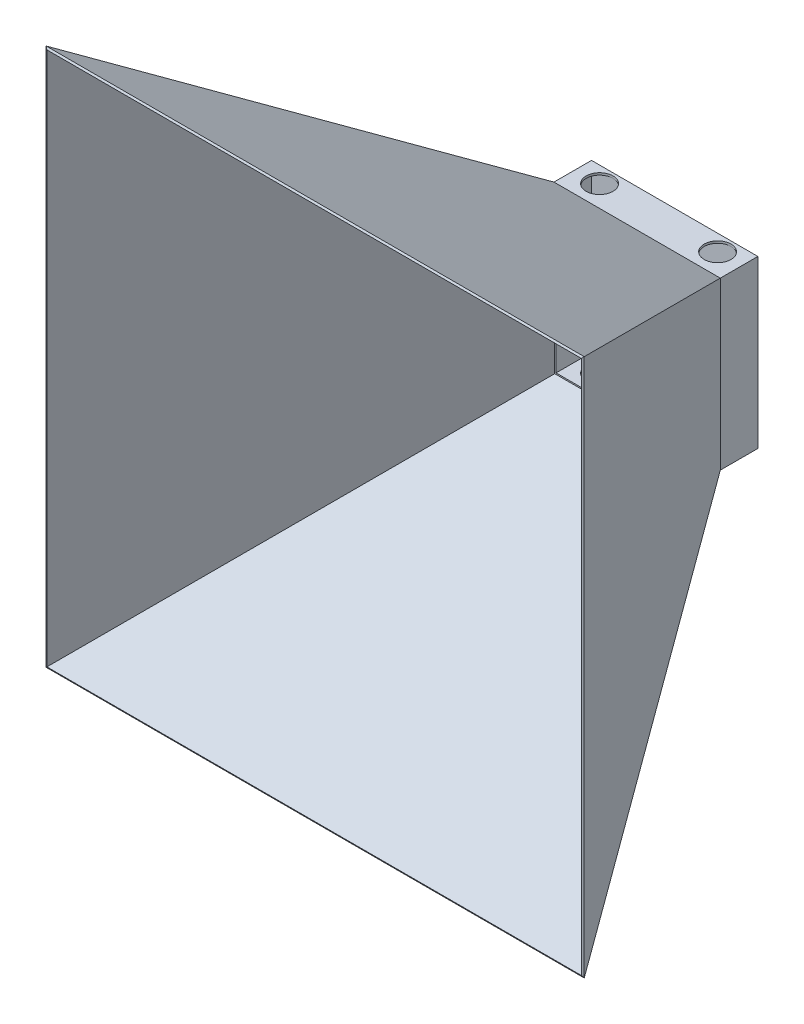
ISO-10303-21;
HEADER;
FILE_DESCRIPTION(('STEP AP214'),'2;1');
FILE_NAME('part.step','',(''),(''),'','','');
FILE_SCHEMA(('AUTOMOTIVE_DESIGN { 1 0 10303 214 1 1 1 1 }'));
ENDSEC;
DATA;
#1=APPLICATION_CONTEXT('core data for automotive mechanical design processes');
#2=APPLICATION_PROTOCOL_DEFINITION('international standard','automotive_design',2000,#1);
#3=PRODUCT_CONTEXT('',#1,'mechanical');
#4=PRODUCT('Part','Part','',(#3));
#5=PRODUCT_RELATED_PRODUCT_CATEGORY('part','',(#4));
#6=PRODUCT_DEFINITION_FORMATION('','',#4);
#7=PRODUCT_DEFINITION_CONTEXT('part definition',#1,'design');
#8=PRODUCT_DEFINITION('design','',#6,#7);
#9=PRODUCT_DEFINITION_SHAPE('','',#8);
#10=(LENGTH_UNIT() NAMED_UNIT(*) SI_UNIT(.MILLI.,.METRE.));
#11=(NAMED_UNIT(*) PLANE_ANGLE_UNIT() SI_UNIT($,.RADIAN.));
#12=(NAMED_UNIT(*) SI_UNIT($,.STERADIAN.) SOLID_ANGLE_UNIT());
#13=UNCERTAINTY_MEASURE_WITH_UNIT(LENGTH_MEASURE(1.E-05),#10,'distance_accuracy_value','');
#14=(GEOMETRIC_REPRESENTATION_CONTEXT(3) GLOBAL_UNCERTAINTY_ASSIGNED_CONTEXT((#13)) GLOBAL_UNIT_ASSIGNED_CONTEXT((#10,
#11,#12)) REPRESENTATION_CONTEXT('',''));
#15=CARTESIAN_POINT('',(0.,0.,0.));
#16=DIRECTION('',(0.,0.,1.));
#17=DIRECTION('',(1.,0.,0.));
#18=AXIS2_PLACEMENT_3D('',#15,#16,#17);
#19=CARTESIAN_POINT('',(-77.5,-77.5,17.5));
#20=DIRECTION('',(0.,0.500000000000001,-0.866025403784438));
#21=DIRECTION('',(1.,0.,0.));
#22=AXIS2_PLACEMENT_3D('',#19,#20,#21);
#23=PLANE('',#22);
#24=DIRECTION('',(-0.654653670707981,-0.654653670707975,-0.377964473009224));
#25=VECTOR('',#24,1.);
#26=CARTESIAN_POINT('',(-75.7679491924311,-75.7679491924311,18.5));
#27=LINE('',#26,#25);
#28=CARTESIAN_POINT('',(-75.7679491924311,-75.7679491924311,18.5));
#29=VERTEX_POINT('',#28);
#30=CARTESIAN_POINT('',(-77.5,-77.5,17.5));
#31=VERTEX_POINT('',#30);
#32=EDGE_CURVE('E12',#29,#31,#27,.T.);
#33=ORIENTED_EDGE('',*,*,#32,.F.);
#34=DIRECTION('',(1.,0.,0.));
#35=VECTOR('',#34,1.);
#36=CARTESIAN_POINT('',(-77.5,-75.7679491924311,18.5));
#37=LINE('',#36,#35);
#38=CARTESIAN_POINT('',(75.7679491924311,-75.7679491924311,18.5));
#39=VERTEX_POINT('',#38);
#40=EDGE_CURVE('E170',#29,#39,#37,.T.);
#41=ORIENTED_EDGE('',*,*,#40,.T.);
#42=DIRECTION('',(0.654653670707978,-0.654653670707978,-0.377964473009225));
#43=VECTOR('',#42,1.);
#44=CARTESIAN_POINT('',(75.7679491924311,-75.7679491924311,18.5));
#45=LINE('',#44,#43);
#46=CARTESIAN_POINT('',(77.5,-77.5,17.5));
#47=VERTEX_POINT('',#46);
#48=EDGE_CURVE('E62',#39,#47,#45,.T.);
#49=ORIENTED_EDGE('',*,*,#48,.T.);
#50=DIRECTION('',(1.,0.,0.));
#51=VECTOR('',#50,1.);
#52=CARTESIAN_POINT('',(-77.5,-77.5,17.5));
#53=LINE('',#52,#51);
#54=EDGE_CURVE('E189',#31,#47,#53,.T.);
#55=ORIENTED_EDGE('',*,*,#54,.F.);
#56=EDGE_LOOP('',(#33,#41,#49,#55));
#57=FACE_BOUND('',#56,.T.);
#58=ADVANCED_FACE('F51',(#57),#23,.T.);
#59=CARTESIAN_POINT('',(77.5,77.5,17.5));
#60=DIRECTION('',(-0.500000000000001,0.,-0.866025403784438));
#61=DIRECTION('',(0.,1.,0.));
#62=AXIS2_PLACEMENT_3D('',#59,#60,#61);
#63=PLANE('',#62);
#64=ORIENTED_EDGE('',*,*,#48,.F.);
#65=DIRECTION('',(0.,1.,0.));
#66=VECTOR('',#65,1.);
#67=CARTESIAN_POINT('',(75.7679491924311,77.5,18.5));
#68=LINE('',#67,#66);
#69=CARTESIAN_POINT('',(75.7679491924312,75.7679491924311,18.5));
#70=VERTEX_POINT('',#69);
#71=EDGE_CURVE('E165',#39,#70,#68,.T.);
#72=ORIENTED_EDGE('',*,*,#71,.T.);
#73=DIRECTION('',(0.654653670707974,0.654653670707979,-0.377964473009229));
#74=VECTOR('',#73,1.);
#75=CARTESIAN_POINT('',(75.7679491924312,75.7679491924311,18.5));
#76=LINE('',#75,#74);
#77=CARTESIAN_POINT('',(77.5,77.5,17.5));
#78=VERTEX_POINT('',#77);
#79=EDGE_CURVE('E70',#70,#78,#76,.T.);
#80=ORIENTED_EDGE('',*,*,#79,.T.);
#81=DIRECTION('',(0.,1.,0.));
#82=VECTOR('',#81,1.);
#83=CARTESIAN_POINT('',(77.5,77.5,17.5));
#84=LINE('',#83,#82);
#85=EDGE_CURVE('E202',#47,#78,#84,.T.);
#86=ORIENTED_EDGE('',*,*,#85,.F.);
#87=EDGE_LOOP('',(#64,#72,#80,#86));
#88=FACE_BOUND('',#87,.T.);
#89=ADVANCED_FACE('F203',(#88),#63,.T.);
#90=CARTESIAN_POINT('',(-77.5,77.5,17.5));
#91=DIRECTION('',(0.,-0.500000000000001,-0.866025403784438));
#92=DIRECTION('',(-1.,0.,0.));
#93=AXIS2_PLACEMENT_3D('',#90,#91,#92);
#94=PLANE('',#93);
#95=ORIENTED_EDGE('',*,*,#79,.F.);
#96=DIRECTION('',(1.,0.,0.));
#97=VECTOR('',#96,1.);
#98=CARTESIAN_POINT('',(-77.5,75.7679491924311,18.5));
#99=LINE('',#98,#97);
#100=CARTESIAN_POINT('',(-75.7679491924311,75.7679491924311,18.5));
#101=VERTEX_POINT('',#100);
#102=EDGE_CURVE('E135',#70,#101,#99,.F.);
#103=ORIENTED_EDGE('',*,*,#102,.T.);
#104=DIRECTION('',(-0.654653670707977,0.654653670707977,-0.377964473009227));
#105=VECTOR('',#104,1.);
#106=CARTESIAN_POINT('',(-75.7679491924311,75.7679491924311,18.5));
#107=LINE('',#106,#105);
#108=CARTESIAN_POINT('',(-77.5,77.5,17.5));
#109=VERTEX_POINT('',#108);
#110=EDGE_CURVE('E55',#101,#109,#107,.T.);
#111=ORIENTED_EDGE('',*,*,#110,.T.);
#112=DIRECTION('',(-1.,0.,0.));
#113=VECTOR('',#112,1.);
#114=CARTESIAN_POINT('',(-77.5,77.5,17.5));
#115=LINE('',#114,#113);
#116=EDGE_CURVE('E184',#78,#109,#115,.T.);
#117=ORIENTED_EDGE('',*,*,#116,.F.);
#118=EDGE_LOOP('',(#95,#103,#111,#117));
#119=FACE_BOUND('',#118,.T.);
#120=ADVANCED_FACE('F150',(#119),#94,.T.);
#121=CARTESIAN_POINT('',(-77.5,-250.705080756888,317.5));
#122=DIRECTION('',(0.,-0.500000000000001,0.866025403784438));
#123=DIRECTION('',(-1.,0.,0.));
#124=AXIS2_PLACEMENT_3D('',#121,#122,#123);
#125=PLANE('',#124);
#126=DIRECTION('',(0.654653670707979,-0.654653670708,-0.377964473009185));
#127=VECTOR('',#126,1.);
#128=CARTESIAN_POINT('',(248.973029949319,-248.973029949319,318.5));
#129=LINE('',#128,#127);
#130=CARTESIAN_POINT('',(248.973029949319,-248.973029949319,318.5));
#131=VERTEX_POINT('',#130);
#132=CARTESIAN_POINT('',(250.705080756888,-250.705080756888,317.5));
#133=VERTEX_POINT('',#132);
#134=EDGE_CURVE('E127',#131,#133,#129,.T.);
#135=ORIENTED_EDGE('',*,*,#134,.F.);
#136=DIRECTION('',(1.,0.,0.));
#137=VECTOR('',#136,1.);
#138=CARTESIAN_POINT('',(-77.5,-248.973029949319,318.5));
#139=LINE('',#138,#137);
#140=CARTESIAN_POINT('',(-248.973029949319,-248.973029949319,318.5));
#141=VERTEX_POINT('',#140);
#142=EDGE_CURVE('E229',#141,#131,#139,.T.);
#143=ORIENTED_EDGE('',*,*,#142,.F.);
#144=DIRECTION('',(-0.654653670707991,-0.654653670707991,-0.37796447300918));
#145=VECTOR('',#144,1.);
#146=CARTESIAN_POINT('',(-248.973029949319,-248.973029949319,318.5));
#147=LINE('',#146,#145);
#148=CARTESIAN_POINT('',(-250.705080756888,-250.705080756888,317.5));
#149=VERTEX_POINT('',#148);
#150=EDGE_CURVE('E176',#141,#149,#147,.T.);
#151=ORIENTED_EDGE('',*,*,#150,.T.);
#152=DIRECTION('',(-1.,0.,0.));
#153=VECTOR('',#152,1.);
#154=CARTESIAN_POINT('',(-77.5,-250.705080756888,317.5));
#155=LINE('',#154,#153);
#156=EDGE_CURVE('E225',#149,#133,#155,.F.);
#157=ORIENTED_EDGE('',*,*,#156,.T.);
#158=EDGE_LOOP('',(#135,#143,#151,#157));
#159=FACE_BOUND('',#158,.T.);
#160=ADVANCED_FACE('F288',(#159),#125,.T.);
#161=CARTESIAN_POINT('',(-250.705080756888,77.5,317.5));
#162=DIRECTION('',(-0.500000000000001,0.,0.866025403784438));
#163=DIRECTION('',(0.,1.,0.));
#164=AXIS2_PLACEMENT_3D('',#161,#162,#163);
#165=PLANE('',#164);
#166=ORIENTED_EDGE('',*,*,#150,.F.);
#167=DIRECTION('',(0.,1.,0.));
#168=VECTOR('',#167,1.);
#169=CARTESIAN_POINT('',(-248.973029949319,77.5,318.5));
#170=LINE('',#169,#168);
#171=CARTESIAN_POINT('',(-248.973029949319,248.973029949319,318.5));
#172=VERTEX_POINT('',#171);
#173=EDGE_CURVE('E142',#172,#141,#170,.F.);
#174=ORIENTED_EDGE('',*,*,#173,.F.);
#175=DIRECTION('',(-0.654653670707991,0.654653670707991,-0.37796447300918));
#176=VECTOR('',#175,1.);
#177=CARTESIAN_POINT('',(-248.973029949319,248.973029949319,318.5));
#178=LINE('',#177,#176);
#179=CARTESIAN_POINT('',(-250.705080756888,250.705080756888,317.5));
#180=VERTEX_POINT('',#179);
#181=EDGE_CURVE('E173',#172,#180,#178,.T.);
#182=ORIENTED_EDGE('',*,*,#181,.T.);
#183=DIRECTION('',(0.,1.,0.));
#184=VECTOR('',#183,1.);
#185=CARTESIAN_POINT('',(-250.705080756888,77.5,317.5));
#186=LINE('',#185,#184);
#187=EDGE_CURVE('E200',#180,#149,#186,.F.);
#188=ORIENTED_EDGE('',*,*,#187,.T.);
#189=EDGE_LOOP('',(#166,#174,#182,#188));
#190=FACE_BOUND('',#189,.T.);
#191=ADVANCED_FACE('F257',(#190),#165,.T.);
#192=CARTESIAN_POINT('',(-77.5,250.705080756888,317.5));
#193=DIRECTION('',(0.,0.500000000000001,0.866025403784438));
#194=DIRECTION('',(1.,0.,0.));
#195=AXIS2_PLACEMENT_3D('',#192,#193,#194);
#196=PLANE('',#195);
#197=ORIENTED_EDGE('',*,*,#181,.F.);
#198=DIRECTION('',(1.,0.,0.));
#199=VECTOR('',#198,1.);
#200=CARTESIAN_POINT('',(-77.5,248.973029949319,318.5));
#201=LINE('',#200,#199);
#202=CARTESIAN_POINT('',(248.973029949319,248.973029949319,318.5));
#203=VERTEX_POINT('',#202);
#204=EDGE_CURVE('E137',#203,#172,#201,.F.);
#205=ORIENTED_EDGE('',*,*,#204,.F.);
#206=DIRECTION('',(0.654653670707992,0.654653670708002,-0.377964473009159));
#207=VECTOR('',#206,1.);
#208=CARTESIAN_POINT('',(248.973029949319,248.973029949319,318.5));
#209=LINE('',#208,#207);
#210=CARTESIAN_POINT('',(250.705080756888,250.705080756888,317.5));
#211=VERTEX_POINT('',#210);
#212=EDGE_CURVE('E177',#203,#211,#209,.T.);
#213=ORIENTED_EDGE('',*,*,#212,.T.);
#214=DIRECTION('',(1.,0.,0.));
#215=VECTOR('',#214,1.);
#216=CARTESIAN_POINT('',(-77.5,250.705080756888,317.5));
#217=LINE('',#216,#215);
#218=EDGE_CURVE('E217',#211,#180,#217,.F.);
#219=ORIENTED_EDGE('',*,*,#218,.T.);
#220=EDGE_LOOP('',(#197,#205,#213,#219));
#221=FACE_BOUND('',#220,.T.);
#222=ADVANCED_FACE('F252',(#221),#196,.T.);
#223=CARTESIAN_POINT('',(250.705080756888,77.5,317.5));
#224=DIRECTION('',(0.500000000000001,0.,0.866025403784438));
#225=DIRECTION('',(0.,-1.,0.));
#226=AXIS2_PLACEMENT_3D('',#223,#224,#225);
#227=PLANE('',#226);
#228=DIRECTION('',(0.,1.,0.));
#229=VECTOR('',#228,1.);
#230=CARTESIAN_POINT('',(248.973029949319,77.5,318.5));
#231=LINE('',#230,#229);
#232=EDGE_CURVE('E163',#131,#203,#231,.T.);
#233=ORIENTED_EDGE('',*,*,#232,.F.);
#234=ORIENTED_EDGE('',*,*,#134,.T.);
#235=DIRECTION('',(0.,-1.,0.));
#236=VECTOR('',#235,1.);
#237=CARTESIAN_POINT('',(250.705080756888,77.5,317.5));
#238=LINE('',#237,#236);
#239=EDGE_CURVE('E153',#133,#211,#238,.F.);
#240=ORIENTED_EDGE('',*,*,#239,.T.);
#241=ORIENTED_EDGE('',*,*,#212,.F.);
#242=EDGE_LOOP('',(#233,#234,#240,#241));
#243=FACE_BOUND('',#242,.T.);
#244=ADVANCED_FACE('F247',(#243),#227,.T.);
#245=CARTESIAN_POINT('',(-77.5,77.5,17.5));
#246=DIRECTION('',(0.500000000000001,0.,-0.866025403784438));
#247=DIRECTION('',(0.,-1.,0.));
#248=AXIS2_PLACEMENT_3D('',#245,#246,#247);
#249=PLANE('',#248);
#250=DIRECTION('',(0.,1.,0.));
#251=VECTOR('',#250,1.);
#252=CARTESIAN_POINT('',(-75.7679491924311,77.5,18.5));
#253=LINE('',#252,#251);
#254=EDGE_CURVE('E119',#101,#29,#253,.F.);
#255=ORIENTED_EDGE('',*,*,#254,.T.);
#256=ORIENTED_EDGE('',*,*,#32,.T.);
#257=DIRECTION('',(0.,-1.,0.));
#258=VECTOR('',#257,1.);
#259=CARTESIAN_POINT('',(-77.5,77.5,17.5));
#260=LINE('',#259,#258);
#261=EDGE_CURVE('E121',#109,#31,#260,.T.);
#262=ORIENTED_EDGE('',*,*,#261,.F.);
#263=ORIENTED_EDGE('',*,*,#110,.F.);
#264=EDGE_LOOP('',(#255,#256,#262,#263));
#265=FACE_BOUND('',#264,.T.);
#266=ADVANCED_FACE('F53',(#265),#249,.T.);
#267=CARTESIAN_POINT('',(-77.5,77.5,17.5));
#268=DIRECTION('',(0.,0.866025403784438,-0.500000000000001));
#269=DIRECTION('',(0.,0.500000000000001,0.866025403784438));
#270=AXIS2_PLACEMENT_3D('',#267,#268,#269);
#271=PLANE('',#270);
#272=ORIENTED_EDGE('',*,*,#218,.F.);
#273=DIRECTION('',(0.447213595499959,0.447213595499959,0.774596669241482));
#274=VECTOR('',#273,1.);
#275=CARTESIAN_POINT('',(77.5,77.5,17.5));
#276=LINE('',#275,#274);
#277=EDGE_CURVE('E207',#78,#211,#276,.T.);
#278=ORIENTED_EDGE('',*,*,#277,.F.);
#279=ORIENTED_EDGE('',*,*,#116,.T.);
#280=DIRECTION('',(-0.447213595499959,0.447213595499959,0.774596669241482));
#281=VECTOR('',#280,1.);
#282=CARTESIAN_POINT('',(-77.5,77.5,17.5));
#283=LINE('',#282,#281);
#284=EDGE_CURVE('E224',#109,#180,#283,.T.);
#285=ORIENTED_EDGE('',*,*,#284,.T.);
#286=EDGE_LOOP('',(#272,#278,#279,#285));
#287=FACE_BOUND('',#286,.T.);
#288=ADVANCED_FACE('F271',(#287),#271,.T.);
#289=CARTESIAN_POINT('',(-77.5,77.5,17.5));
#290=DIRECTION('',(-0.866025403784438,0.,-0.500000000000001));
#291=DIRECTION('',(-0.500000000000001,0.,0.866025403784438));
#292=AXIS2_PLACEMENT_3D('',#289,#290,#291);
#293=PLANE('',#292);
#294=ORIENTED_EDGE('',*,*,#187,.F.);
#295=ORIENTED_EDGE('',*,*,#284,.F.);
#296=ORIENTED_EDGE('',*,*,#261,.T.);
#297=DIRECTION('',(-0.447213595499959,-0.447213595499959,0.774596669241482));
#298=VECTOR('',#297,1.);
#299=CARTESIAN_POINT('',(-46.4999999999999,-46.4999999999999,-36.1935750346352));
#300=LINE('',#299,#298);
#301=EDGE_CURVE('E198',#31,#149,#300,.T.);
#302=ORIENTED_EDGE('',*,*,#301,.T.);
#303=EDGE_LOOP('',(#294,#295,#296,#302));
#304=FACE_BOUND('',#303,.T.);
#305=ADVANCED_FACE('F260',(#304),#293,.T.);
#306=CARTESIAN_POINT('',(-77.5,-77.5,17.5));
#307=DIRECTION('',(0.,-0.866025403784438,-0.500000000000001));
#308=DIRECTION('',(0.,0.500000000000001,-0.866025403784438));
#309=AXIS2_PLACEMENT_3D('',#306,#307,#308);
#310=PLANE('',#309);
#311=ORIENTED_EDGE('',*,*,#156,.F.);
#312=ORIENTED_EDGE('',*,*,#301,.F.);
#313=ORIENTED_EDGE('',*,*,#54,.T.);
#314=DIRECTION('',(0.447213595499959,-0.447213595499959,0.774596669241482));
#315=VECTOR('',#314,1.);
#316=CARTESIAN_POINT('',(46.4999999999999,-46.4999999999999,-36.1935750346352));
#317=LINE('',#316,#315);
#318=EDGE_CURVE('E158',#47,#133,#317,.T.);
#319=ORIENTED_EDGE('',*,*,#318,.T.);
#320=EDGE_LOOP('',(#311,#312,#313,#319));
#321=FACE_BOUND('',#320,.T.);
#322=ADVANCED_FACE('F195',(#321),#310,.T.);
#323=CARTESIAN_POINT('',(77.5,77.5,17.5));
#324=DIRECTION('',(0.866025403784438,0.,-0.500000000000001));
#325=DIRECTION('',(-0.500000000000001,0.,-0.866025403784438));
#326=AXIS2_PLACEMENT_3D('',#323,#324,#325);
#327=PLANE('',#326);
#328=ORIENTED_EDGE('',*,*,#239,.F.);
#329=ORIENTED_EDGE('',*,*,#318,.F.);
#330=ORIENTED_EDGE('',*,*,#85,.T.);
#331=ORIENTED_EDGE('',*,*,#277,.T.);
#332=EDGE_LOOP('',(#328,#329,#330,#331));
#333=FACE_BOUND('',#332,.T.);
#334=ADVANCED_FACE('F210',(#333),#327,.T.);
#335=CARTESIAN_POINT('',(-77.5,75.7679491924311,18.5));
#336=DIRECTION('',(0.,0.866025403784438,-0.500000000000001));
#337=DIRECTION('',(0.,0.500000000000001,0.866025403784438));
#338=AXIS2_PLACEMENT_3D('',#335,#336,#337);
#339=PLANE('',#338);
#340=ORIENTED_EDGE('',*,*,#204,.T.);
#341=DIRECTION('',(-0.447213595499959,0.447213595499959,0.774596669241482));
#342=VECTOR('',#341,1.);
#343=CARTESIAN_POINT('',(-76.1143593539449,76.1143593539449,19.1));
#344=LINE('',#343,#342);
#345=EDGE_CURVE('E132',#101,#172,#344,.T.);
#346=ORIENTED_EDGE('',*,*,#345,.F.);
#347=ORIENTED_EDGE('',*,*,#102,.F.);
#348=DIRECTION('',(0.447213595499959,0.447213595499959,0.774596669241482));
#349=VECTOR('',#348,1.);
#350=CARTESIAN_POINT('',(76.1143593539449,76.1143593539449,19.1));
#351=LINE('',#350,#349);
#352=EDGE_CURVE('E168',#70,#203,#351,.T.);
#353=ORIENTED_EDGE('',*,*,#352,.T.);
#354=EDGE_LOOP('',(#340,#346,#347,#353));
#355=FACE_BOUND('',#354,.T.);
#356=ADVANCED_FACE('F133',(#355),#339,.F.);
#357=CARTESIAN_POINT('',(-75.7679491924311,77.5,18.5));
#358=DIRECTION('',(-0.866025403784438,0.,-0.500000000000001));
#359=DIRECTION('',(-0.500000000000001,0.,0.866025403784438));
#360=AXIS2_PLACEMENT_3D('',#357,#358,#359);
#361=PLANE('',#360);
#362=ORIENTED_EDGE('',*,*,#173,.T.);
#363=DIRECTION('',(-0.447213595499959,-0.447213595499959,0.774596669241482));
#364=VECTOR('',#363,1.);
#365=CARTESIAN_POINT('',(-45.1143593539448,-45.1143593539448,-34.5935750346352));
#366=LINE('',#365,#364);
#367=EDGE_CURVE('E146',#29,#141,#366,.T.);
#368=ORIENTED_EDGE('',*,*,#367,.F.);
#369=ORIENTED_EDGE('',*,*,#254,.F.);
#370=ORIENTED_EDGE('',*,*,#345,.T.);
#371=EDGE_LOOP('',(#362,#368,#369,#370));
#372=FACE_BOUND('',#371,.T.);
#373=ADVANCED_FACE('F144',(#372),#361,.F.);
#374=CARTESIAN_POINT('',(-77.5,-75.7679491924311,18.5));
#375=DIRECTION('',(0.,-0.866025403784438,-0.500000000000001));
#376=DIRECTION('',(0.,0.500000000000001,-0.866025403784438));
#377=AXIS2_PLACEMENT_3D('',#374,#375,#376);
#378=PLANE('',#377);
#379=ORIENTED_EDGE('',*,*,#142,.T.);
#380=DIRECTION('',(0.447213595499959,-0.447213595499959,0.774596669241482));
#381=VECTOR('',#380,1.);
#382=CARTESIAN_POINT('',(45.1143593539448,-45.1143593539448,-34.5935750346352));
#383=LINE('',#382,#381);
#384=EDGE_CURVE('E169',#39,#131,#383,.T.);
#385=ORIENTED_EDGE('',*,*,#384,.F.);
#386=ORIENTED_EDGE('',*,*,#40,.F.);
#387=ORIENTED_EDGE('',*,*,#367,.T.);
#388=EDGE_LOOP('',(#379,#385,#386,#387));
#389=FACE_BOUND('',#388,.T.);
#390=ADVANCED_FACE('F242',(#389),#378,.F.);
#391=CARTESIAN_POINT('',(75.7679491924311,77.5,18.5));
#392=DIRECTION('',(0.866025403784438,0.,-0.500000000000001));
#393=DIRECTION('',(-0.500000000000001,0.,-0.866025403784438));
#394=AXIS2_PLACEMENT_3D('',#391,#392,#393);
#395=PLANE('',#394);
#396=ORIENTED_EDGE('',*,*,#232,.T.);
#397=ORIENTED_EDGE('',*,*,#352,.F.);
#398=ORIENTED_EDGE('',*,*,#71,.F.);
#399=ORIENTED_EDGE('',*,*,#384,.T.);
#400=EDGE_LOOP('',(#396,#397,#398,#399));
#401=FACE_BOUND('',#400,.T.);
#402=ADVANCED_FACE('F250',(#401),#395,.F.);
#403=CLOSED_SHELL('',(#58,#89,#120,#160,#191,#222,#244,#266,#288,#305,#322,#334,#356,#373,#390,#402));
#404=MANIFOLD_SOLID_BREP('B2',#403);
#405=CARTESIAN_POINT('',(77.5,77.5,17.5));
#406=DIRECTION('',(0.,0.,-1.));
#407=DIRECTION('',(-1.,0.,0.));
#408=AXIS2_PLACEMENT_3D('',#405,#406,#407);
#409=PLANE('',#408);
#410=DIRECTION('',(1.,0.,0.));
#411=VECTOR('',#410,1.);
#412=CARTESIAN_POINT('',(77.5,-77.5,17.5));
#413=LINE('',#412,#411);
#414=CARTESIAN_POINT('',(-77.5,-77.5,17.5));
#415=VERTEX_POINT('',#414);
#416=CARTESIAN_POINT('',(77.5,-77.5,17.5));
#417=VERTEX_POINT('',#416);
#418=EDGE_CURVE('E532',#415,#417,#413,.T.);
#419=ORIENTED_EDGE('',*,*,#418,.T.);
#420=DIRECTION('',(0.,-1.,0.));
#421=VECTOR('',#420,1.);
#422=CARTESIAN_POINT('',(77.5,77.5,17.5));
#423=LINE('',#422,#421);
#424=CARTESIAN_POINT('',(77.5,77.5,17.5));
#425=VERTEX_POINT('',#424);
#426=EDGE_CURVE('E412',#425,#417,#423,.T.);
#427=ORIENTED_EDGE('',*,*,#426,.F.);
#428=DIRECTION('',(1.,0.,0.));
#429=VECTOR('',#428,1.);
#430=CARTESIAN_POINT('',(77.5,77.5,17.5));
#431=LINE('',#430,#429);
#432=CARTESIAN_POINT('',(-77.5,77.5,17.5));
#433=VERTEX_POINT('',#432);
#434=EDGE_CURVE('E457',#433,#425,#431,.T.);
#435=ORIENTED_EDGE('',*,*,#434,.F.);
#436=DIRECTION('',(0.,-1.,0.));
#437=VECTOR('',#436,1.);
#438=CARTESIAN_POINT('',(-77.5,77.5,17.5));
#439=LINE('',#438,#437);
#440=EDGE_CURVE('E49',#433,#415,#439,.T.);
#441=ORIENTED_EDGE('',*,*,#440,.T.);
#442=EDGE_LOOP('',(#419,#427,#435,#441));
#443=FACE_BOUND('',#442,.T.);
#444=DIRECTION('',(1.,0.,0.));
#445=VECTOR('',#444,1.);
#446=CARTESIAN_POINT('',(77.5,-75.5,17.5));
#447=LINE('',#446,#445);
#448=CARTESIAN_POINT('',(-75.5,-75.5,17.5));
#449=VERTEX_POINT('',#448);
#450=CARTESIAN_POINT('',(75.5,-75.5,17.5));
#451=VERTEX_POINT('',#450);
#452=EDGE_CURVE('E501',#449,#451,#447,.T.);
#453=ORIENTED_EDGE('',*,*,#452,.F.);
#454=DIRECTION('',(0.,-1.,0.));
#455=VECTOR('',#454,1.);
#456=CARTESIAN_POINT('',(-75.5,77.5,17.5));
#457=LINE('',#456,#455);
#458=CARTESIAN_POINT('',(-75.5,75.5,17.5));
#459=VERTEX_POINT('',#458);
#460=EDGE_CURVE('E500',#459,#449,#457,.T.);
#461=ORIENTED_EDGE('',*,*,#460,.F.);
#462=DIRECTION('',(1.,0.,0.));
#463=VECTOR('',#462,1.);
#464=CARTESIAN_POINT('',(77.5,75.5,17.5));
#465=LINE('',#464,#463);
#466=CARTESIAN_POINT('',(75.5,75.5,17.5));
#467=VERTEX_POINT('',#466);
#468=EDGE_CURVE('E509',#459,#467,#465,.T.);
#469=ORIENTED_EDGE('',*,*,#468,.T.);
#470=DIRECTION('',(0.,-1.,0.));
#471=VECTOR('',#470,1.);
#472=CARTESIAN_POINT('',(75.5,77.5,17.5));
#473=LINE('',#472,#471);
#474=EDGE_CURVE('E514',#467,#451,#473,.T.);
#475=ORIENTED_EDGE('',*,*,#474,.T.);
#476=EDGE_LOOP('',(#453,#461,#469,#475));
#477=FACE_BOUND('',#476,.T.);
#478=ADVANCED_FACE('F403',(#443,#477),#409,.F.);
#479=CARTESIAN_POINT('',(-77.5,77.5,17.5));
#480=DIRECTION('',(1.,0.,0.));
#481=DIRECTION('',(0.,0.,-1.));
#482=AXIS2_PLACEMENT_3D('',#479,#480,#481);
#483=PLANE('',#482);
#484=DIRECTION('',(0.,0.,1.));
#485=VECTOR('',#484,1.);
#486=CARTESIAN_POINT('',(-77.5,-77.5,17.5));
#487=LINE('',#486,#485);
#488=CARTESIAN_POINT('',(-77.5,-77.5,-17.5));
#489=VERTEX_POINT('',#488);
#490=EDGE_CURVE('E517',#489,#415,#487,.T.);
#491=ORIENTED_EDGE('',*,*,#490,.T.);
#492=ORIENTED_EDGE('',*,*,#440,.F.);
#493=DIRECTION('',(0.,0.,1.));
#494=VECTOR('',#493,1.);
#495=CARTESIAN_POINT('',(-77.5,77.5,17.5));
#496=LINE('',#495,#494);
#497=CARTESIAN_POINT('',(-77.5,77.5,-17.5));
#498=VERTEX_POINT('',#497);
#499=EDGE_CURVE('E523',#498,#433,#496,.T.);
#500=ORIENTED_EDGE('',*,*,#499,.F.);
#501=DIRECTION('',(0.,-1.,0.));
#502=VECTOR('',#501,1.);
#503=CARTESIAN_POINT('',(-77.5,77.5,-17.5));
#504=LINE('',#503,#502);
#505=EDGE_CURVE('E529',#498,#489,#504,.T.);
#506=ORIENTED_EDGE('',*,*,#505,.T.);
#507=EDGE_LOOP('',(#491,#492,#500,#506));
#508=FACE_BOUND('',#507,.T.);
#509=ADVANCED_FACE('F405',(#508),#483,.F.);
#510=CARTESIAN_POINT('',(77.5,77.5,17.5));
#511=DIRECTION('',(-1.,0.,0.));
#512=DIRECTION('',(0.,0.,1.));
#513=AXIS2_PLACEMENT_3D('',#510,#511,#512);
#514=PLANE('',#513);
#515=DIRECTION('',(0.,0.,-1.));
#516=VECTOR('',#515,1.);
#517=CARTESIAN_POINT('',(77.5,-77.5,17.5));
#518=LINE('',#517,#516);
#519=CARTESIAN_POINT('',(77.5,-77.5,-17.5));
#520=VERTEX_POINT('',#519);
#521=EDGE_CURVE('E534',#417,#520,#518,.T.);
#522=ORIENTED_EDGE('',*,*,#521,.T.);
#523=DIRECTION('',(0.,-1.,0.));
#524=VECTOR('',#523,1.);
#525=CARTESIAN_POINT('',(77.5,77.5,-17.5));
#526=LINE('',#525,#524);
#527=CARTESIAN_POINT('',(77.5,77.5,-17.5));
#528=VERTEX_POINT('',#527);
#529=EDGE_CURVE('E538',#528,#520,#526,.T.);
#530=ORIENTED_EDGE('',*,*,#529,.F.);
#531=DIRECTION('',(0.,0.,-1.));
#532=VECTOR('',#531,1.);
#533=CARTESIAN_POINT('',(77.5,77.5,17.5));
#534=LINE('',#533,#532);
#535=EDGE_CURVE('E526',#425,#528,#534,.T.);
#536=ORIENTED_EDGE('',*,*,#535,.F.);
#537=ORIENTED_EDGE('',*,*,#426,.T.);
#538=EDGE_LOOP('',(#522,#530,#536,#537));
#539=FACE_BOUND('',#538,.T.);
#540=ADVANCED_FACE('F580',(#539),#514,.F.);
#541=CARTESIAN_POINT('',(77.5,77.5,-17.5));
#542=DIRECTION('',(0.,0.,1.));
#543=DIRECTION('',(1.,0.,0.));
#544=AXIS2_PLACEMENT_3D('',#541,#542,#543);
#545=PLANE('',#544);
#546=DIRECTION('',(-1.,0.,0.));
#547=VECTOR('',#546,1.);
#548=CARTESIAN_POINT('',(77.5,-77.5,-17.5));
#549=LINE('',#548,#547);
#550=EDGE_CURVE('E450',#520,#489,#549,.T.);
#551=ORIENTED_EDGE('',*,*,#550,.T.);
#552=ORIENTED_EDGE('',*,*,#505,.F.);
#553=DIRECTION('',(-1.,0.,0.));
#554=VECTOR('',#553,1.);
#555=CARTESIAN_POINT('',(77.5,77.5,-17.5));
#556=LINE('',#555,#554);
#557=EDGE_CURVE('E429',#528,#498,#556,.T.);
#558=ORIENTED_EDGE('',*,*,#557,.F.);
#559=ORIENTED_EDGE('',*,*,#529,.T.);
#560=EDGE_LOOP('',(#551,#552,#558,#559));
#561=FACE_BOUND('',#560,.T.);
#562=ADVANCED_FACE('F576',(#561),#545,.F.);
#563=CARTESIAN_POINT('',(0.,77.5,0.));
#564=DIRECTION('',(0.,1.,0.));
#565=DIRECTION('',(0.,0.,1.));
#566=AXIS2_PLACEMENT_3D('',#563,#564,#565);
#567=PLANE('',#566);
#568=CARTESIAN_POINT('',(-55.,77.5,-2.49999999999999));
#569=DIRECTION('',(0.,-1.,0.));
#570=DIRECTION('',(0.,0.,-1.));
#571=AXIS2_PLACEMENT_3D('',#568,#569,#570);
#572=CIRCLE('',#571,12.5);
#573=CARTESIAN_POINT('',(-55.,77.5,-15.));
#574=VERTEX_POINT('',#573);
#575=EDGE_CURVE('E544',#574,#574,#572,.T.);
#576=ORIENTED_EDGE('',*,*,#575,.T.);
#577=EDGE_LOOP('',(#576));
#578=FACE_BOUND('',#577,.T.);
#579=CARTESIAN_POINT('',(55.,77.5,-2.49999999999999));
#580=DIRECTION('',(0.,-1.,0.));
#581=DIRECTION('',(0.,0.,1.));
#582=AXIS2_PLACEMENT_3D('',#579,#580,#581);
#583=CIRCLE('',#582,12.5);
#584=CARTESIAN_POINT('',(55.,77.5,10.));
#585=VERTEX_POINT('',#584);
#586=EDGE_CURVE('E554',#585,#585,#583,.T.);
#587=ORIENTED_EDGE('',*,*,#586,.T.);
#588=EDGE_LOOP('',(#587));
#589=FACE_BOUND('',#588,.T.);
#590=ORIENTED_EDGE('',*,*,#499,.T.);
#591=ORIENTED_EDGE('',*,*,#434,.T.);
#592=ORIENTED_EDGE('',*,*,#535,.T.);
#593=ORIENTED_EDGE('',*,*,#557,.T.);
#594=EDGE_LOOP('',(#590,#591,#592,#593));
#595=FACE_BOUND('',#594,.T.);
#596=ADVANCED_FACE('F568',(#578,#589,#595),#567,.T.);
#597=CARTESIAN_POINT('',(0.,-77.5,0.));
#598=DIRECTION('',(0.,1.,0.));
#599=DIRECTION('',(0.,0.,1.));
#600=AXIS2_PLACEMENT_3D('',#597,#598,#599);
#601=PLANE('',#600);
#602=CARTESIAN_POINT('',(-55.,-77.5,-2.49999999999999));
#603=DIRECTION('',(0.,-1.,0.));
#604=DIRECTION('',(0.,0.,-1.));
#605=AXIS2_PLACEMENT_3D('',#602,#603,#604);
#606=CIRCLE('',#605,12.5);
#607=CARTESIAN_POINT('',(-55.,-77.5,-15.));
#608=VERTEX_POINT('',#607);
#609=EDGE_CURVE('E549',#608,#608,#606,.T.);
#610=ORIENTED_EDGE('',*,*,#609,.F.);
#611=EDGE_LOOP('',(#610));
#612=FACE_BOUND('',#611,.T.);
#613=CARTESIAN_POINT('',(55.,-77.5,-2.49999999999999));
#614=DIRECTION('',(0.,-1.,0.));
#615=DIRECTION('',(0.,0.,1.));
#616=AXIS2_PLACEMENT_3D('',#613,#614,#615);
#617=CIRCLE('',#616,12.5);
#618=CARTESIAN_POINT('',(55.,-77.5,10.));
#619=VERTEX_POINT('',#618);
#620=EDGE_CURVE('E559',#619,#619,#617,.T.);
#621=ORIENTED_EDGE('',*,*,#620,.F.);
#622=EDGE_LOOP('',(#621));
#623=FACE_BOUND('',#622,.T.);
#624=ORIENTED_EDGE('',*,*,#490,.F.);
#625=ORIENTED_EDGE('',*,*,#550,.F.);
#626=ORIENTED_EDGE('',*,*,#521,.F.);
#627=ORIENTED_EDGE('',*,*,#418,.F.);
#628=EDGE_LOOP('',(#624,#625,#626,#627));
#629=FACE_BOUND('',#628,.T.);
#630=ADVANCED_FACE('F565',(#612,#623,#629),#601,.F.);
#631=CARTESIAN_POINT('',(-75.5,77.5,17.5));
#632=DIRECTION('',(1.,0.,0.));
#633=DIRECTION('',(0.,0.,-1.));
#634=AXIS2_PLACEMENT_3D('',#631,#632,#633);
#635=PLANE('',#634);
#636=DIRECTION('',(0.,0.,1.));
#637=VECTOR('',#636,1.);
#638=CARTESIAN_POINT('',(-75.5,-75.5,17.5));
#639=LINE('',#638,#637);
#640=CARTESIAN_POINT('',(-75.5,-75.5,-15.5));
#641=VERTEX_POINT('',#640);
#642=EDGE_CURVE('E484',#641,#449,#639,.T.);
#643=ORIENTED_EDGE('',*,*,#642,.F.);
#644=DIRECTION('',(0.,-1.,0.));
#645=VECTOR('',#644,1.);
#646=CARTESIAN_POINT('',(-75.5,77.5,-15.5));
#647=LINE('',#646,#645);
#648=CARTESIAN_POINT('',(-75.5,75.5,-15.5));
#649=VERTEX_POINT('',#648);
#650=EDGE_CURVE('E492',#649,#641,#647,.T.);
#651=ORIENTED_EDGE('',*,*,#650,.F.);
#652=DIRECTION('',(0.,0.,1.));
#653=VECTOR('',#652,1.);
#654=CARTESIAN_POINT('',(-75.5,75.5,17.5));
#655=LINE('',#654,#653);
#656=EDGE_CURVE('E420',#649,#459,#655,.T.);
#657=ORIENTED_EDGE('',*,*,#656,.T.);
#658=ORIENTED_EDGE('',*,*,#460,.T.);
#659=EDGE_LOOP('',(#643,#651,#657,#658));
#660=FACE_BOUND('',#659,.T.);
#661=ADVANCED_FACE('F498',(#660),#635,.T.);
#662=CARTESIAN_POINT('',(75.5,77.5,17.5));
#663=DIRECTION('',(-1.,0.,0.));
#664=DIRECTION('',(0.,0.,1.));
#665=AXIS2_PLACEMENT_3D('',#662,#663,#664);
#666=PLANE('',#665);
#667=DIRECTION('',(0.,0.,-1.));
#668=VECTOR('',#667,1.);
#669=CARTESIAN_POINT('',(75.5,-75.5,17.5));
#670=LINE('',#669,#668);
#671=CARTESIAN_POINT('',(75.5,-75.5,-15.5));
#672=VERTEX_POINT('',#671);
#673=EDGE_CURVE('E487',#451,#672,#670,.T.);
#674=ORIENTED_EDGE('',*,*,#673,.F.);
#675=ORIENTED_EDGE('',*,*,#474,.F.);
#676=DIRECTION('',(0.,0.,-1.));
#677=VECTOR('',#676,1.);
#678=CARTESIAN_POINT('',(75.5,75.5,17.5));
#679=LINE('',#678,#677);
#680=CARTESIAN_POINT('',(75.5,75.5,-15.5));
#681=VERTEX_POINT('',#680);
#682=EDGE_CURVE('E512',#467,#681,#679,.T.);
#683=ORIENTED_EDGE('',*,*,#682,.T.);
#684=DIRECTION('',(0.,-1.,0.));
#685=VECTOR('',#684,1.);
#686=CARTESIAN_POINT('',(75.5,77.5,-15.5));
#687=LINE('',#686,#685);
#688=EDGE_CURVE('E496',#681,#672,#687,.T.);
#689=ORIENTED_EDGE('',*,*,#688,.T.);
#690=EDGE_LOOP('',(#674,#675,#683,#689));
#691=FACE_BOUND('',#690,.T.);
#692=ADVANCED_FACE('F584',(#691),#666,.T.);
#693=CARTESIAN_POINT('',(77.5,77.5,-15.5));
#694=DIRECTION('',(0.,0.,1.));
#695=DIRECTION('',(1.,0.,0.));
#696=AXIS2_PLACEMENT_3D('',#693,#694,#695);
#697=PLANE('',#696);
#698=DIRECTION('',(-1.,0.,0.));
#699=VECTOR('',#698,1.);
#700=CARTESIAN_POINT('',(77.5,-75.5,-15.5));
#701=LINE('',#700,#699);
#702=EDGE_CURVE('E480',#672,#641,#701,.T.);
#703=ORIENTED_EDGE('',*,*,#702,.F.);
#704=ORIENTED_EDGE('',*,*,#688,.F.);
#705=DIRECTION('',(-1.,0.,0.));
#706=VECTOR('',#705,1.);
#707=CARTESIAN_POINT('',(77.5,75.5,-15.5));
#708=LINE('',#707,#706);
#709=EDGE_CURVE('E495',#681,#649,#708,.T.);
#710=ORIENTED_EDGE('',*,*,#709,.T.);
#711=ORIENTED_EDGE('',*,*,#650,.T.);
#712=EDGE_LOOP('',(#703,#704,#710,#711));
#713=FACE_BOUND('',#712,.T.);
#714=ADVANCED_FACE('F493',(#713),#697,.T.);
#715=CARTESIAN_POINT('',(0.,75.5,0.));
#716=DIRECTION('',(0.,1.,0.));
#717=DIRECTION('',(0.,0.,1.));
#718=AXIS2_PLACEMENT_3D('',#715,#716,#717);
#719=PLANE('',#718);
#720=CARTESIAN_POINT('',(-55.,75.5,-2.49999999999999));
#721=DIRECTION('',(0.,1.,0.));
#722=DIRECTION('',(0.,0.,1.));
#723=AXIS2_PLACEMENT_3D('',#720,#721,#722);
#724=CIRCLE('',#723,12.5);
#725=CARTESIAN_POINT('',(-55.,75.5,10.));
#726=VERTEX_POINT('',#725);
#727=EDGE_CURVE('E502',#726,#726,#724,.T.);
#728=ORIENTED_EDGE('',*,*,#727,.T.);
#729=EDGE_LOOP('',(#728));
#730=FACE_BOUND('',#729,.T.);
#731=CARTESIAN_POINT('',(55.,75.5,-2.49999999999999));
#732=DIRECTION('',(0.,1.,0.));
#733=DIRECTION('',(0.,0.,1.));
#734=AXIS2_PLACEMENT_3D('',#731,#732,#733);
#735=CIRCLE('',#734,12.5);
#736=CARTESIAN_POINT('',(55.,75.5,10.));
#737=VERTEX_POINT('',#736);
#738=EDGE_CURVE('E543',#737,#737,#735,.T.);
#739=ORIENTED_EDGE('',*,*,#738,.T.);
#740=EDGE_LOOP('',(#739));
#741=FACE_BOUND('',#740,.T.);
#742=ORIENTED_EDGE('',*,*,#656,.F.);
#743=ORIENTED_EDGE('',*,*,#709,.F.);
#744=ORIENTED_EDGE('',*,*,#682,.F.);
#745=ORIENTED_EDGE('',*,*,#468,.F.);
#746=EDGE_LOOP('',(#742,#743,#744,#745));
#747=FACE_BOUND('',#746,.T.);
#748=ADVANCED_FACE('F587',(#730,#741,#747),#719,.F.);
#749=CARTESIAN_POINT('',(0.,-75.5,0.));
#750=DIRECTION('',(0.,1.,0.));
#751=DIRECTION('',(0.,0.,1.));
#752=AXIS2_PLACEMENT_3D('',#749,#750,#751);
#753=PLANE('',#752);
#754=CARTESIAN_POINT('',(-55.,-75.5,-2.49999999999999));
#755=DIRECTION('',(0.,1.,0.));
#756=DIRECTION('',(0.,0.,1.));
#757=AXIS2_PLACEMENT_3D('',#754,#755,#756);
#758=CIRCLE('',#757,12.5);
#759=CARTESIAN_POINT('',(-55.,-75.5,10.));
#760=VERTEX_POINT('',#759);
#761=EDGE_CURVE('E407',#760,#760,#758,.T.);
#762=ORIENTED_EDGE('',*,*,#761,.F.);
#763=EDGE_LOOP('',(#762));
#764=FACE_BOUND('',#763,.T.);
#765=CARTESIAN_POINT('',(55.,-75.5,-2.49999999999999));
#766=DIRECTION('',(0.,1.,0.));
#767=DIRECTION('',(0.,0.,1.));
#768=AXIS2_PLACEMENT_3D('',#765,#766,#767);
#769=CIRCLE('',#768,12.5);
#770=CARTESIAN_POINT('',(55.,-75.5,10.));
#771=VERTEX_POINT('',#770);
#772=EDGE_CURVE('E541',#771,#771,#769,.T.);
#773=ORIENTED_EDGE('',*,*,#772,.F.);
#774=EDGE_LOOP('',(#773));
#775=FACE_BOUND('',#774,.T.);
#776=ORIENTED_EDGE('',*,*,#642,.T.);
#777=ORIENTED_EDGE('',*,*,#452,.T.);
#778=ORIENTED_EDGE('',*,*,#673,.T.);
#779=ORIENTED_EDGE('',*,*,#702,.T.);
#780=EDGE_LOOP('',(#776,#777,#778,#779));
#781=FACE_BOUND('',#780,.T.);
#782=ADVANCED_FACE('F482',(#764,#775,#781),#753,.T.);
#783=CARTESIAN_POINT('',(55.,77.5,-2.49999999999999));
#784=DIRECTION('',(0.,-1.,0.));
#785=DIRECTION('',(0.,0.,-1.));
#786=AXIS2_PLACEMENT_3D('',#783,#784,#785);
#787=CYLINDRICAL_SURFACE('',#786,12.5);
#788=ORIENTED_EDGE('',*,*,#772,.T.);
#789=EDGE_LOOP('',(#788));
#790=FACE_BOUND('',#789,.T.);
#791=ORIENTED_EDGE('',*,*,#620,.T.);
#792=EDGE_LOOP('',(#791));
#793=FACE_BOUND('',#792,.T.);
#794=ADVANCED_FACE('F563',(#790,#793),#787,.F.);
#795=CARTESIAN_POINT('',(-55.,77.5,-2.49999999999999));
#796=DIRECTION('',(0.,-1.,0.));
#797=DIRECTION('',(0.,0.,-1.));
#798=AXIS2_PLACEMENT_3D('',#795,#796,#797);
#799=CYLINDRICAL_SURFACE('',#798,12.5);
#800=ORIENTED_EDGE('',*,*,#761,.T.);
#801=EDGE_LOOP('',(#800));
#802=FACE_BOUND('',#801,.T.);
#803=ORIENTED_EDGE('',*,*,#609,.T.);
#804=EDGE_LOOP('',(#803));
#805=FACE_BOUND('',#804,.T.);
#806=ADVANCED_FACE('F670',(#802,#805),#799,.F.);
#807=ORIENTED_EDGE('',*,*,#586,.F.);
#808=EDGE_LOOP('',(#807));
#809=FACE_BOUND('',#808,.T.);
#810=ORIENTED_EDGE('',*,*,#738,.F.);
#811=EDGE_LOOP('',(#810));
#812=FACE_BOUND('',#811,.T.);
#813=ADVANCED_FACE('F672',(#809,#812),#787,.F.);
#814=ORIENTED_EDGE('',*,*,#575,.F.);
#815=EDGE_LOOP('',(#814));
#816=FACE_BOUND('',#815,.T.);
#817=ORIENTED_EDGE('',*,*,#727,.F.);
#818=EDGE_LOOP('',(#817));
#819=FACE_BOUND('',#818,.T.);
#820=ADVANCED_FACE('F682',(#816,#819),#799,.F.);
#821=CLOSED_SHELL('',(#478,#509,#540,#562,#596,#630,#661,#692,#714,#748,#782,#794,#806,#813,#820));
#822=MANIFOLD_SOLID_BREP('B6',#821);
#823=ADVANCED_BREP_SHAPE_REPRESENTATION('',(#18,#404,#822),#14);
#824=SHAPE_DEFINITION_REPRESENTATION(#9,#823);
ENDSEC;
END-ISO-10303-21;
